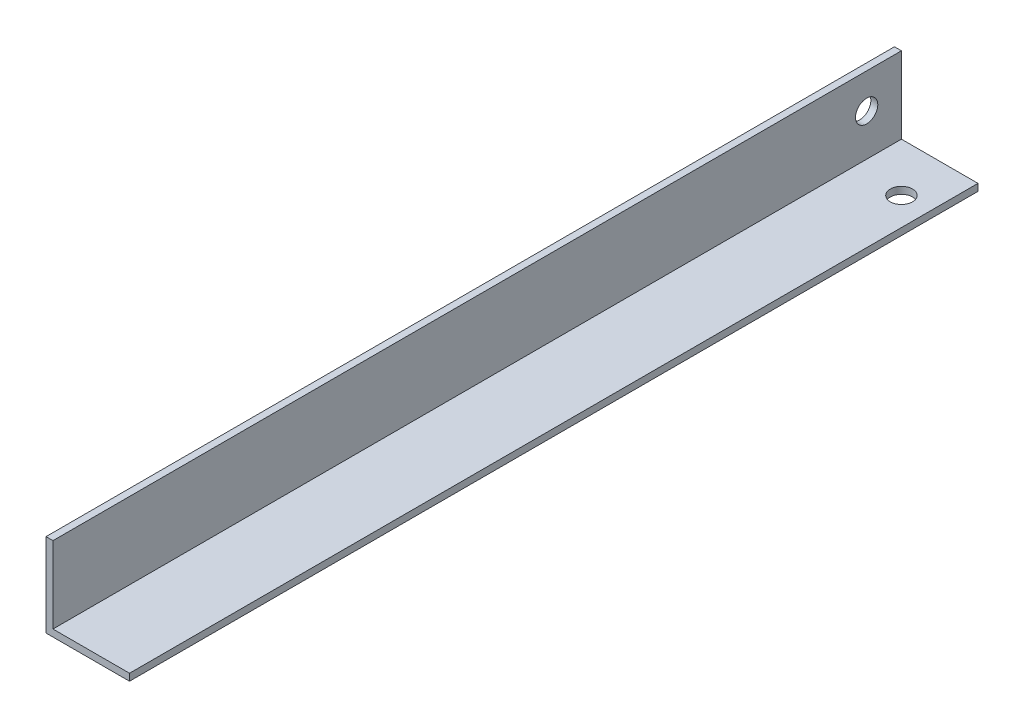
ISO-10303-21;
HEADER;
FILE_DESCRIPTION(('STEP AP214'),'2;1');
FILE_NAME('part.step','',(''),(''),'','','');
FILE_SCHEMA(('AUTOMOTIVE_DESIGN { 1 0 10303 214 1 1 1 1 }'));
ENDSEC;
DATA;
#1=APPLICATION_CONTEXT('core data for automotive mechanical design processes');
#2=APPLICATION_PROTOCOL_DEFINITION('international standard','automotive_design',2000,#1);
#3=PRODUCT_CONTEXT('',#1,'mechanical');
#4=PRODUCT('Part','Part','',(#3));
#5=PRODUCT_RELATED_PRODUCT_CATEGORY('part','',(#4));
#6=PRODUCT_DEFINITION_FORMATION('','',#4);
#7=PRODUCT_DEFINITION_CONTEXT('part definition',#1,'design');
#8=PRODUCT_DEFINITION('design','',#6,#7);
#9=PRODUCT_DEFINITION_SHAPE('','',#8);
#10=(LENGTH_UNIT() NAMED_UNIT(*) SI_UNIT(.MILLI.,.METRE.));
#11=(NAMED_UNIT(*) PLANE_ANGLE_UNIT() SI_UNIT($,.RADIAN.));
#12=(NAMED_UNIT(*) SI_UNIT($,.STERADIAN.) SOLID_ANGLE_UNIT());
#13=UNCERTAINTY_MEASURE_WITH_UNIT(LENGTH_MEASURE(1.E-05),#10,'distance_accuracy_value','');
#14=(GEOMETRIC_REPRESENTATION_CONTEXT(3) GLOBAL_UNCERTAINTY_ASSIGNED_CONTEXT((#13)) GLOBAL_UNIT_ASSIGNED_CONTEXT((#10,
#11,#12)) REPRESENTATION_CONTEXT('',''));
#15=CARTESIAN_POINT('',(0.,0.,0.));
#16=DIRECTION('',(0.,0.,1.));
#17=DIRECTION('',(1.,0.,0.));
#18=AXIS2_PLACEMENT_3D('',#15,#16,#17);
#19=CARTESIAN_POINT('',(30.,0.,304.8));
#20=DIRECTION('',(0.,1.,0.));
#21=DIRECTION('',(-1.,0.,0.));
#22=AXIS2_PLACEMENT_3D('',#19,#20,#21);
#23=PLANE('',#22);
#24=CARTESIAN_POINT('',(20.,0.,17.5));
#25=DIRECTION('',(0.,1.,0.));
#26=DIRECTION('',(-1.,0.,0.));
#27=AXIS2_PLACEMENT_3D('',#24,#25,#26);
#28=CIRCLE('',#27,4.);
#29=CARTESIAN_POINT('',(16.,0.,17.5));
#30=VERTEX_POINT('',#29);
#31=EDGE_CURVE('E121',#30,#30,#28,.T.);
#32=ORIENTED_EDGE('',*,*,#31,.T.);
#33=EDGE_LOOP('',(#32));
#34=FACE_BOUND('',#33,.T.);
#35=DIRECTION('',(1.,0.,0.));
#36=VECTOR('',#35,1.);
#37=CARTESIAN_POINT('',(30.,0.,0.));
#38=LINE('',#37,#36);
#39=CARTESIAN_POINT('',(0.,0.,0.));
#40=VERTEX_POINT('',#39);
#41=CARTESIAN_POINT('',(30.,0.,0.));
#42=VERTEX_POINT('',#41);
#43=EDGE_CURVE('E117',#40,#42,#38,.T.);
#44=ORIENTED_EDGE('',*,*,#43,.T.);
#45=DIRECTION('',(0.,0.,-1.));
#46=VECTOR('',#45,1.);
#47=CARTESIAN_POINT('',(30.,0.,304.8));
#48=LINE('',#47,#46);
#49=CARTESIAN_POINT('',(30.,0.,304.8));
#50=VERTEX_POINT('',#49);
#51=EDGE_CURVE('E11',#50,#42,#48,.T.);
#52=ORIENTED_EDGE('',*,*,#51,.F.);
#53=DIRECTION('',(1.,0.,0.));
#54=VECTOR('',#53,1.);
#55=CARTESIAN_POINT('',(30.,0.,304.8));
#56=LINE('',#55,#54);
#57=CARTESIAN_POINT('',(0.,0.,304.8));
#58=VERTEX_POINT('',#57);
#59=EDGE_CURVE('E128',#58,#50,#56,.T.);
#60=ORIENTED_EDGE('',*,*,#59,.F.);
#61=DIRECTION('',(0.,0.,-1.));
#62=VECTOR('',#61,1.);
#63=CARTESIAN_POINT('',(0.,0.,304.8));
#64=LINE('',#63,#62);
#65=EDGE_CURVE('E113',#58,#40,#64,.T.);
#66=ORIENTED_EDGE('',*,*,#65,.T.);
#67=EDGE_LOOP('',(#44,#52,#60,#66));
#68=FACE_BOUND('',#67,.T.);
#69=ADVANCED_FACE('F33',(#34,#68),#23,.F.);
#70=CARTESIAN_POINT('',(30.,2.5,304.8));
#71=DIRECTION('',(-1.,0.,0.));
#72=DIRECTION('',(0.,0.,1.));
#73=AXIS2_PLACEMENT_3D('',#70,#71,#72);
#74=PLANE('',#73);
#75=DIRECTION('',(0.,1.,0.));
#76=VECTOR('',#75,1.);
#77=CARTESIAN_POINT('',(30.,2.5,0.));
#78=LINE('',#77,#76);
#79=CARTESIAN_POINT('',(30.,2.5,0.));
#80=VERTEX_POINT('',#79);
#81=EDGE_CURVE('E120',#42,#80,#78,.T.);
#82=ORIENTED_EDGE('',*,*,#81,.T.);
#83=DIRECTION('',(0.,0.,-1.));
#84=VECTOR('',#83,1.);
#85=CARTESIAN_POINT('',(30.,2.5,304.8));
#86=LINE('',#85,#84);
#87=CARTESIAN_POINT('',(30.,2.5,304.8));
#88=VERTEX_POINT('',#87);
#89=EDGE_CURVE('E41',#88,#80,#86,.T.);
#90=ORIENTED_EDGE('',*,*,#89,.F.);
#91=DIRECTION('',(0.,1.,0.));
#92=VECTOR('',#91,1.);
#93=CARTESIAN_POINT('',(30.,2.5,304.8));
#94=LINE('',#93,#92);
#95=EDGE_CURVE('E86',#50,#88,#94,.T.);
#96=ORIENTED_EDGE('',*,*,#95,.F.);
#97=ORIENTED_EDGE('',*,*,#51,.T.);
#98=EDGE_LOOP('',(#82,#90,#96,#97));
#99=FACE_BOUND('',#98,.T.);
#100=ADVANCED_FACE('F154',(#99),#74,.F.);
#101=CARTESIAN_POINT('',(2.5,2.5,304.8));
#102=DIRECTION('',(0.,-1.,0.));
#103=DIRECTION('',(1.,0.,0.));
#104=AXIS2_PLACEMENT_3D('',#101,#102,#103);
#105=PLANE('',#104);
#106=CARTESIAN_POINT('',(20.,2.5,17.5));
#107=DIRECTION('',(0.,1.,0.));
#108=DIRECTION('',(-1.,0.,0.));
#109=AXIS2_PLACEMENT_3D('',#106,#107,#108);
#110=CIRCLE('',#109,4.);
#111=CARTESIAN_POINT('',(16.,2.5,17.5));
#112=VERTEX_POINT('',#111);
#113=EDGE_CURVE('E162',#112,#112,#110,.T.);
#114=ORIENTED_EDGE('',*,*,#113,.F.);
#115=EDGE_LOOP('',(#114));
#116=FACE_BOUND('',#115,.T.);
#117=DIRECTION('',(-1.,0.,0.));
#118=VECTOR('',#117,1.);
#119=CARTESIAN_POINT('',(2.5,2.5,0.));
#120=LINE('',#119,#118);
#121=CARTESIAN_POINT('',(2.5,2.5,0.));
#122=VERTEX_POINT('',#121);
#123=EDGE_CURVE('E123',#80,#122,#120,.T.);
#124=ORIENTED_EDGE('',*,*,#123,.T.);
#125=DIRECTION('',(0.,0.,-1.));
#126=VECTOR('',#125,1.);
#127=CARTESIAN_POINT('',(2.5,2.5,304.8));
#128=LINE('',#127,#126);
#129=CARTESIAN_POINT('',(2.5,2.5,304.8));
#130=VERTEX_POINT('',#129);
#131=EDGE_CURVE('E108',#130,#122,#128,.T.);
#132=ORIENTED_EDGE('',*,*,#131,.F.);
#133=DIRECTION('',(-1.,0.,0.));
#134=VECTOR('',#133,1.);
#135=CARTESIAN_POINT('',(2.5,2.5,304.8));
#136=LINE('',#135,#134);
#137=EDGE_CURVE('E99',#88,#130,#136,.T.);
#138=ORIENTED_EDGE('',*,*,#137,.F.);
#139=ORIENTED_EDGE('',*,*,#89,.T.);
#140=EDGE_LOOP('',(#124,#132,#138,#139));
#141=FACE_BOUND('',#140,.T.);
#142=ADVANCED_FACE('F134',(#116,#141),#105,.F.);
#143=CARTESIAN_POINT('',(2.5,30.,304.8));
#144=DIRECTION('',(-1.,0.,0.));
#145=DIRECTION('',(0.,-1.,0.));
#146=AXIS2_PLACEMENT_3D('',#143,#144,#145);
#147=PLANE('',#146);
#148=CARTESIAN_POINT('',(2.5,17.5,12.5));
#149=DIRECTION('',(1.,0.,0.));
#150=DIRECTION('',(0.,1.,0.));
#151=AXIS2_PLACEMENT_3D('',#148,#149,#150);
#152=CIRCLE('',#151,4.);
#153=CARTESIAN_POINT('',(2.5,21.5,12.5));
#154=VERTEX_POINT('',#153);
#155=EDGE_CURVE('E168',#154,#154,#152,.T.);
#156=ORIENTED_EDGE('',*,*,#155,.F.);
#157=EDGE_LOOP('',(#156));
#158=FACE_BOUND('',#157,.T.);
#159=DIRECTION('',(0.,1.,0.));
#160=VECTOR('',#159,1.);
#161=CARTESIAN_POINT('',(2.5,30.,0.));
#162=LINE('',#161,#160);
#163=CARTESIAN_POINT('',(2.5,30.,0.));
#164=VERTEX_POINT('',#163);
#165=EDGE_CURVE('E107',#122,#164,#162,.T.);
#166=ORIENTED_EDGE('',*,*,#165,.T.);
#167=DIRECTION('',(0.,0.,-1.));
#168=VECTOR('',#167,1.);
#169=CARTESIAN_POINT('',(2.5,30.,304.8));
#170=LINE('',#169,#168);
#171=CARTESIAN_POINT('',(2.5,30.,304.8));
#172=VERTEX_POINT('',#171);
#173=EDGE_CURVE('E104',#172,#164,#170,.T.);
#174=ORIENTED_EDGE('',*,*,#173,.F.);
#175=DIRECTION('',(0.,1.,0.));
#176=VECTOR('',#175,1.);
#177=CARTESIAN_POINT('',(2.5,30.,304.8));
#178=LINE('',#177,#176);
#179=EDGE_CURVE('E93',#130,#172,#178,.T.);
#180=ORIENTED_EDGE('',*,*,#179,.F.);
#181=ORIENTED_EDGE('',*,*,#131,.T.);
#182=EDGE_LOOP('',(#166,#174,#180,#181));
#183=FACE_BOUND('',#182,.T.);
#184=ADVANCED_FACE('F105',(#158,#183),#147,.F.);
#185=CARTESIAN_POINT('',(0.,30.,304.8));
#186=DIRECTION('',(0.,-1.,0.));
#187=DIRECTION('',(0.,0.,-1.));
#188=AXIS2_PLACEMENT_3D('',#185,#186,#187);
#189=PLANE('',#188);
#190=DIRECTION('',(-1.,0.,0.));
#191=VECTOR('',#190,1.);
#192=CARTESIAN_POINT('',(0.,30.,0.));
#193=LINE('',#192,#191);
#194=CARTESIAN_POINT('',(0.,30.,0.));
#195=VERTEX_POINT('',#194);
#196=EDGE_CURVE('E72',#164,#195,#193,.T.);
#197=ORIENTED_EDGE('',*,*,#196,.T.);
#198=DIRECTION('',(0.,0.,-1.));
#199=VECTOR('',#198,1.);
#200=CARTESIAN_POINT('',(0.,30.,304.8));
#201=LINE('',#200,#199);
#202=CARTESIAN_POINT('',(0.,30.,304.8));
#203=VERTEX_POINT('',#202);
#204=EDGE_CURVE('E109',#203,#195,#201,.T.);
#205=ORIENTED_EDGE('',*,*,#204,.F.);
#206=DIRECTION('',(-1.,0.,0.));
#207=VECTOR('',#206,1.);
#208=CARTESIAN_POINT('',(0.,30.,304.8));
#209=LINE('',#208,#207);
#210=EDGE_CURVE('E97',#172,#203,#209,.T.);
#211=ORIENTED_EDGE('',*,*,#210,.F.);
#212=ORIENTED_EDGE('',*,*,#173,.T.);
#213=EDGE_LOOP('',(#197,#205,#211,#212));
#214=FACE_BOUND('',#213,.T.);
#215=ADVANCED_FACE('F111',(#214),#189,.F.);
#216=CARTESIAN_POINT('',(0.,0.,304.8));
#217=DIRECTION('',(1.,0.,0.));
#218=DIRECTION('',(0.,0.,-1.));
#219=AXIS2_PLACEMENT_3D('',#216,#217,#218);
#220=PLANE('',#219);
#221=CARTESIAN_POINT('',(0.,17.5,12.5));
#222=DIRECTION('',(1.,0.,0.));
#223=DIRECTION('',(0.,1.,0.));
#224=AXIS2_PLACEMENT_3D('',#221,#222,#223);
#225=CIRCLE('',#224,4.);
#226=CARTESIAN_POINT('',(0.,21.5,12.5));
#227=VERTEX_POINT('',#226);
#228=EDGE_CURVE('E165',#227,#227,#225,.T.);
#229=ORIENTED_EDGE('',*,*,#228,.T.);
#230=EDGE_LOOP('',(#229));
#231=FACE_BOUND('',#230,.T.);
#232=DIRECTION('',(0.,-1.,0.));
#233=VECTOR('',#232,1.);
#234=CARTESIAN_POINT('',(0.,0.,0.));
#235=LINE('',#234,#233);
#236=EDGE_CURVE('E78',#195,#40,#235,.T.);
#237=ORIENTED_EDGE('',*,*,#236,.T.);
#238=ORIENTED_EDGE('',*,*,#65,.F.);
#239=DIRECTION('',(0.,-1.,0.));
#240=VECTOR('',#239,1.);
#241=CARTESIAN_POINT('',(0.,0.,304.8));
#242=LINE('',#241,#240);
#243=EDGE_CURVE('E49',#203,#58,#242,.T.);
#244=ORIENTED_EDGE('',*,*,#243,.F.);
#245=ORIENTED_EDGE('',*,*,#204,.T.);
#246=EDGE_LOOP('',(#237,#238,#244,#245));
#247=FACE_BOUND('',#246,.T.);
#248=ADVANCED_FACE('F141',(#231,#247),#220,.F.);
#249=CARTESIAN_POINT('',(0.,0.,304.8));
#250=DIRECTION('',(0.,0.,-1.));
#251=DIRECTION('',(-1.,0.,0.));
#252=AXIS2_PLACEMENT_3D('',#249,#250,#251);
#253=PLANE('',#252);
#254=ORIENTED_EDGE('',*,*,#59,.T.);
#255=ORIENTED_EDGE('',*,*,#95,.T.);
#256=ORIENTED_EDGE('',*,*,#137,.T.);
#257=ORIENTED_EDGE('',*,*,#179,.T.);
#258=ORIENTED_EDGE('',*,*,#210,.T.);
#259=ORIENTED_EDGE('',*,*,#243,.T.);
#260=EDGE_LOOP('',(#254,#255,#256,#257,#258,#259));
#261=FACE_BOUND('',#260,.T.);
#262=ADVANCED_FACE('F95',(#261),#253,.F.);
#263=CARTESIAN_POINT('',(0.,0.,0.));
#264=DIRECTION('',(0.,0.,-1.));
#265=DIRECTION('',(-1.,0.,0.));
#266=AXIS2_PLACEMENT_3D('',#263,#264,#265);
#267=PLANE('',#266);
#268=ORIENTED_EDGE('',*,*,#43,.F.);
#269=ORIENTED_EDGE('',*,*,#236,.F.);
#270=ORIENTED_EDGE('',*,*,#196,.F.);
#271=ORIENTED_EDGE('',*,*,#165,.F.);
#272=ORIENTED_EDGE('',*,*,#123,.F.);
#273=ORIENTED_EDGE('',*,*,#81,.F.);
#274=EDGE_LOOP('',(#268,#269,#270,#271,#272,#273));
#275=FACE_BOUND('',#274,.T.);
#276=ADVANCED_FACE('F137',(#275),#267,.T.);
#277=CARTESIAN_POINT('',(20.,0.,17.5));
#278=DIRECTION('',(0.,1.,0.));
#279=DIRECTION('',(-1.,0.,0.));
#280=AXIS2_PLACEMENT_3D('',#277,#278,#279);
#281=CYLINDRICAL_SURFACE('',#280,4.);
#282=ORIENTED_EDGE('',*,*,#31,.F.);
#283=EDGE_LOOP('',(#282));
#284=FACE_BOUND('',#283,.T.);
#285=ORIENTED_EDGE('',*,*,#113,.T.);
#286=EDGE_LOOP('',(#285));
#287=FACE_BOUND('',#286,.T.);
#288=ADVANCED_FACE('F178',(#284,#287),#281,.F.);
#289=CARTESIAN_POINT('',(0.,17.5,12.5));
#290=DIRECTION('',(1.,0.,0.));
#291=DIRECTION('',(0.,1.,0.));
#292=AXIS2_PLACEMENT_3D('',#289,#290,#291);
#293=CYLINDRICAL_SURFACE('',#292,4.);
#294=ORIENTED_EDGE('',*,*,#228,.F.);
#295=EDGE_LOOP('',(#294));
#296=FACE_BOUND('',#295,.T.);
#297=ORIENTED_EDGE('',*,*,#155,.T.);
#298=EDGE_LOOP('',(#297));
#299=FACE_BOUND('',#298,.T.);
#300=ADVANCED_FACE('F175',(#296,#299),#293,.F.);
#301=CLOSED_SHELL('',(#69,#100,#142,#184,#215,#248,#262,#276,#288,#300));
#302=MANIFOLD_SOLID_BREP('B2',#301);
#303=ADVANCED_BREP_SHAPE_REPRESENTATION('',(#18,#302),#14);
#304=SHAPE_DEFINITION_REPRESENTATION(#9,#303);
ENDSEC;
END-ISO-10303-21;
